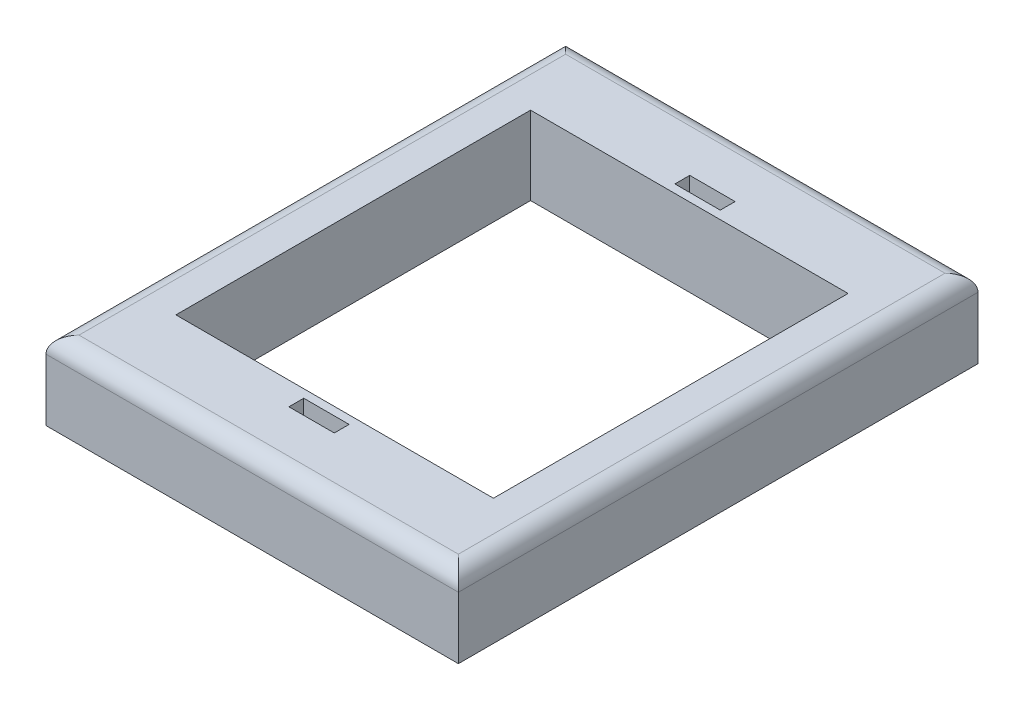
ISO-10303-21;
HEADER;
FILE_DESCRIPTION(('STEP AP214'),'2;1');
FILE_NAME('part.step','',(''),(''),'','','');
FILE_SCHEMA(('AUTOMOTIVE_DESIGN { 1 0 10303 214 1 1 1 1 }'));
ENDSEC;
DATA;
#1=APPLICATION_CONTEXT('core data for automotive mechanical design processes');
#2=APPLICATION_PROTOCOL_DEFINITION('international standard','automotive_design',2000,#1);
#3=PRODUCT_CONTEXT('',#1,'mechanical');
#4=PRODUCT('Part','Part','',(#3));
#5=PRODUCT_RELATED_PRODUCT_CATEGORY('part','',(#4));
#6=PRODUCT_DEFINITION_FORMATION('','',#4);
#7=PRODUCT_DEFINITION_CONTEXT('part definition',#1,'design');
#8=PRODUCT_DEFINITION('design','',#6,#7);
#9=PRODUCT_DEFINITION_SHAPE('','',#8);
#10=(LENGTH_UNIT() NAMED_UNIT(*) SI_UNIT(.MILLI.,.METRE.));
#11=(NAMED_UNIT(*) PLANE_ANGLE_UNIT() SI_UNIT($,.RADIAN.));
#12=(NAMED_UNIT(*) SI_UNIT($,.STERADIAN.) SOLID_ANGLE_UNIT());
#13=UNCERTAINTY_MEASURE_WITH_UNIT(LENGTH_MEASURE(1.E-05),#10,'distance_accuracy_value','');
#14=(GEOMETRIC_REPRESENTATION_CONTEXT(3) GLOBAL_UNCERTAINTY_ASSIGNED_CONTEXT((#13)) GLOBAL_UNIT_ASSIGNED_CONTEXT((#10,
#11,#12)) REPRESENTATION_CONTEXT('',''));
#15=CARTESIAN_POINT('',(0.,0.,0.));
#16=DIRECTION('',(0.,0.,1.));
#17=DIRECTION('',(1.,0.,0.));
#18=AXIS2_PLACEMENT_3D('',#15,#16,#17);
#19=CARTESIAN_POINT('',(0.,9.5,0.));
#20=DIRECTION('',(0.,-1.,0.));
#21=DIRECTION('',(0.,0.,-1.));
#22=AXIS2_PLACEMENT_3D('',#19,#20,#21);
#23=PLANE('',#22);
#24=DIRECTION('',(-1.,0.,0.));
#25=VECTOR('',#24,1.);
#26=CARTESIAN_POINT('',(0.,9.5,-37.6431451612903));
#27=LINE('',#26,#25);
#28=CARTESIAN_POINT('',(-0.459677419354818,9.5,-37.6431451612903));
#29=VERTEX_POINT('',#28);
#30=CARTESIAN_POINT('',(-46.4596774193548,9.5,-37.6431451612903));
#31=VERTEX_POINT('',#30);
#32=EDGE_CURVE('E288',#29,#31,#27,.T.);
#33=ORIENTED_EDGE('',*,*,#32,.T.);
#34=DIRECTION('',(0.,0.,1.));
#35=VECTOR('',#34,1.);
#36=CARTESIAN_POINT('',(-46.4596774193548,9.5,0.));
#37=LINE('',#36,#35);
#38=CARTESIAN_POINT('',(-46.4596774193548,9.5,21.3568548387097));
#39=VERTEX_POINT('',#38);
#40=EDGE_CURVE('E294',#31,#39,#37,.T.);
#41=ORIENTED_EDGE('',*,*,#40,.T.);
#42=DIRECTION('',(1.,0.,0.));
#43=VECTOR('',#42,1.);
#44=CARTESIAN_POINT('',(0.,9.5,21.3568548387097));
#45=LINE('',#44,#43);
#46=CARTESIAN_POINT('',(-0.459677419354811,9.5,21.3568548387097));
#47=VERTEX_POINT('',#46);
#48=EDGE_CURVE('E292',#39,#47,#45,.T.);
#49=ORIENTED_EDGE('',*,*,#48,.T.);
#50=DIRECTION('',(0.,0.,-1.));
#51=VECTOR('',#50,1.);
#52=CARTESIAN_POINT('',(-0.459677419354814,9.5,0.));
#53=LINE('',#52,#51);
#54=EDGE_CURVE('E290',#47,#29,#53,.T.);
#55=ORIENTED_EDGE('',*,*,#54,.T.);
#56=EDGE_LOOP('',(#33,#41,#49,#55));
#57=FACE_BOUND('',#56,.T.);
#58=DIRECTION('',(1.,0.,0.));
#59=VECTOR('',#58,1.);
#60=CARTESIAN_POINT('',(-26.2096774193548,9.5,-30.6431451612903));
#61=LINE('',#60,#59);
#62=CARTESIAN_POINT('',(-26.2096774193548,9.5,-30.6431451612903));
#63=VERTEX_POINT('',#62);
#64=CARTESIAN_POINT('',(-20.7096774193548,9.5,-30.6431451612903));
#65=VERTEX_POINT('',#64);
#66=EDGE_CURVE('E196',#63,#65,#61,.T.);
#67=ORIENTED_EDGE('',*,*,#66,.F.);
#68=DIRECTION('',(0.,0.,1.));
#69=VECTOR('',#68,1.);
#70=CARTESIAN_POINT('',(-26.2096774193548,9.5,-32.4431451612903));
#71=LINE('',#70,#69);
#72=CARTESIAN_POINT('',(-26.2096774193548,9.5,-32.4431451612903));
#73=VERTEX_POINT('',#72);
#74=EDGE_CURVE('E169',#73,#63,#71,.T.);
#75=ORIENTED_EDGE('',*,*,#74,.F.);
#76=DIRECTION('',(-1.,0.,0.));
#77=VECTOR('',#76,1.);
#78=CARTESIAN_POINT('',(-26.2096774193548,9.5,-32.4431451612903));
#79=LINE('',#78,#77);
#80=CARTESIAN_POINT('',(-20.7096774193548,9.5,-32.4431451612903));
#81=VERTEX_POINT('',#80);
#82=EDGE_CURVE('E187',#81,#73,#79,.T.);
#83=ORIENTED_EDGE('',*,*,#82,.F.);
#84=DIRECTION('',(0.,0.,-1.));
#85=VECTOR('',#84,1.);
#86=CARTESIAN_POINT('',(-20.7096774193548,9.5,-32.4431451612903));
#87=LINE('',#86,#85);
#88=EDGE_CURVE('E190',#65,#81,#87,.T.);
#89=ORIENTED_EDGE('',*,*,#88,.F.);
#90=EDGE_LOOP('',(#67,#75,#83,#89));
#91=FACE_BOUND('',#90,.T.);
#92=DIRECTION('',(1.,0.,0.));
#93=VECTOR('',#92,1.);
#94=CARTESIAN_POINT('',(-26.2096774193548,9.5,16.1568548387097));
#95=LINE('',#94,#93);
#96=CARTESIAN_POINT('',(-26.2096774193548,9.5,16.1568548387097));
#97=VERTEX_POINT('',#96);
#98=CARTESIAN_POINT('',(-20.7096774193548,9.5,16.1568548387097));
#99=VERTEX_POINT('',#98);
#100=EDGE_CURVE('E223',#97,#99,#95,.T.);
#101=ORIENTED_EDGE('',*,*,#100,.F.);
#102=DIRECTION('',(0.,0.,1.));
#103=VECTOR('',#102,1.);
#104=CARTESIAN_POINT('',(-26.2096774193548,9.5,14.3568548387097));
#105=LINE('',#104,#103);
#106=CARTESIAN_POINT('',(-26.2096774193548,9.5,14.3568548387097));
#107=VERTEX_POINT('',#106);
#108=EDGE_CURVE('E221',#107,#97,#105,.T.);
#109=ORIENTED_EDGE('',*,*,#108,.F.);
#110=DIRECTION('',(-1.,0.,0.));
#111=VECTOR('',#110,1.);
#112=CARTESIAN_POINT('',(-26.2096774193548,9.5,14.3568548387097));
#113=LINE('',#112,#111);
#114=CARTESIAN_POINT('',(-20.7096774193548,9.5,14.3568548387097));
#115=VERTEX_POINT('',#114);
#116=EDGE_CURVE('E211',#115,#107,#113,.T.);
#117=ORIENTED_EDGE('',*,*,#116,.F.);
#118=DIRECTION('',(0.,0.,-1.));
#119=VECTOR('',#118,1.);
#120=CARTESIAN_POINT('',(-20.7096774193548,9.5,14.3568548387097));
#121=LINE('',#120,#119);
#122=EDGE_CURVE('E226',#99,#115,#121,.T.);
#123=ORIENTED_EDGE('',*,*,#122,.F.);
#124=EDGE_LOOP('',(#101,#109,#117,#123));
#125=FACE_BOUND('',#124,.T.);
#126=DIRECTION('',(0.,0.,-1.));
#127=VECTOR('',#126,1.);
#128=CARTESIAN_POINT('',(-4.20967741935482,9.5,-29.6431451612903));
#129=LINE('',#128,#127);
#130=CARTESIAN_POINT('',(-4.20967741935481,9.5,13.3568548387097));
#131=VERTEX_POINT('',#130);
#132=CARTESIAN_POINT('',(-4.20967741935482,9.5,-29.6431451612903));
#133=VERTEX_POINT('',#132);
#134=EDGE_CURVE('E238',#131,#133,#129,.T.);
#135=ORIENTED_EDGE('',*,*,#134,.F.);
#136=DIRECTION('',(1.,0.,0.));
#137=VECTOR('',#136,1.);
#138=CARTESIAN_POINT('',(-42.7096774193548,9.5,13.3568548387097));
#139=LINE('',#138,#137);
#140=CARTESIAN_POINT('',(-42.7096774193548,9.5,13.3568548387097));
#141=VERTEX_POINT('',#140);
#142=EDGE_CURVE('E246',#141,#131,#139,.T.);
#143=ORIENTED_EDGE('',*,*,#142,.F.);
#144=DIRECTION('',(0.,0.,1.));
#145=VECTOR('',#144,1.);
#146=CARTESIAN_POINT('',(-42.7096774193548,9.5,-29.6431451612903));
#147=LINE('',#146,#145);
#148=CARTESIAN_POINT('',(-42.7096774193548,9.5,-29.6431451612903));
#149=VERTEX_POINT('',#148);
#150=EDGE_CURVE('E243',#149,#141,#147,.T.);
#151=ORIENTED_EDGE('',*,*,#150,.F.);
#152=DIRECTION('',(-1.,0.,0.));
#153=VECTOR('',#152,1.);
#154=CARTESIAN_POINT('',(-4.20967741935482,9.5,-29.6431451612903));
#155=LINE('',#154,#153);
#156=EDGE_CURVE('E240',#133,#149,#155,.T.);
#157=ORIENTED_EDGE('',*,*,#156,.F.);
#158=EDGE_LOOP('',(#135,#143,#151,#157));
#159=FACE_BOUND('',#158,.T.);
#160=ADVANCED_FACE('F37',(#57,#91,#125,#159),#23,.F.);
#161=CARTESIAN_POINT('',(0.,0.,0.));
#162=DIRECTION('',(0.,-1.,0.));
#163=DIRECTION('',(0.,0.,-1.));
#164=AXIS2_PLACEMENT_3D('',#161,#162,#163);
#165=PLANE('',#164);
#166=DIRECTION('',(0.,0.,1.));
#167=VECTOR('',#166,1.);
#168=CARTESIAN_POINT('',(-26.2096774193548,0.,-32.4431451612903));
#169=LINE('',#168,#167);
#170=CARTESIAN_POINT('',(-26.2096774193548,0.,-32.4431451612903));
#171=VERTEX_POINT('',#170);
#172=CARTESIAN_POINT('',(-26.2096774193548,0.,-30.6431451612903));
#173=VERTEX_POINT('',#172);
#174=EDGE_CURVE('E166',#171,#173,#169,.T.);
#175=ORIENTED_EDGE('',*,*,#174,.T.);
#176=DIRECTION('',(1.,0.,0.));
#177=VECTOR('',#176,1.);
#178=CARTESIAN_POINT('',(-26.2096774193548,0.,-30.6431451612903));
#179=LINE('',#178,#177);
#180=CARTESIAN_POINT('',(-20.7096774193548,0.,-30.6431451612903));
#181=VERTEX_POINT('',#180);
#182=EDGE_CURVE('E178',#173,#181,#179,.T.);
#183=ORIENTED_EDGE('',*,*,#182,.T.);
#184=DIRECTION('',(0.,0.,-1.));
#185=VECTOR('',#184,1.);
#186=CARTESIAN_POINT('',(-20.7096774193548,0.,-32.4431451612903));
#187=LINE('',#186,#185);
#188=CARTESIAN_POINT('',(-20.7096774193548,0.,-32.4431451612903));
#189=VERTEX_POINT('',#188);
#190=EDGE_CURVE('E182',#181,#189,#187,.T.);
#191=ORIENTED_EDGE('',*,*,#190,.T.);
#192=DIRECTION('',(-1.,0.,0.));
#193=VECTOR('',#192,1.);
#194=CARTESIAN_POINT('',(-26.2096774193548,0.,-32.4431451612903));
#195=LINE('',#194,#193);
#196=EDGE_CURVE('E174',#189,#171,#195,.T.);
#197=ORIENTED_EDGE('',*,*,#196,.T.);
#198=EDGE_LOOP('',(#175,#183,#191,#197));
#199=FACE_BOUND('',#198,.T.);
#200=DIRECTION('',(0.,0.,1.));
#201=VECTOR('',#200,1.);
#202=CARTESIAN_POINT('',(-26.2096774193548,0.,14.3568548387097));
#203=LINE('',#202,#201);
#204=CARTESIAN_POINT('',(-26.2096774193548,0.,14.3568548387097));
#205=VERTEX_POINT('',#204);
#206=CARTESIAN_POINT('',(-26.2096774193548,0.,16.1568548387097));
#207=VERTEX_POINT('',#206);
#208=EDGE_CURVE('E207',#205,#207,#203,.T.);
#209=ORIENTED_EDGE('',*,*,#208,.T.);
#210=DIRECTION('',(1.,0.,0.));
#211=VECTOR('',#210,1.);
#212=CARTESIAN_POINT('',(-26.2096774193548,0.,16.1568548387097));
#213=LINE('',#212,#211);
#214=CARTESIAN_POINT('',(-20.7096774193548,0.,16.1568548387097));
#215=VERTEX_POINT('',#214);
#216=EDGE_CURVE('E210',#207,#215,#213,.T.);
#217=ORIENTED_EDGE('',*,*,#216,.T.);
#218=DIRECTION('',(0.,0.,-1.));
#219=VECTOR('',#218,1.);
#220=CARTESIAN_POINT('',(-20.7096774193548,0.,14.3568548387097));
#221=LINE('',#220,#219);
#222=CARTESIAN_POINT('',(-20.7096774193548,0.,14.3568548387097));
#223=VERTEX_POINT('',#222);
#224=EDGE_CURVE('E214',#215,#223,#221,.T.);
#225=ORIENTED_EDGE('',*,*,#224,.T.);
#226=DIRECTION('',(-1.,0.,0.));
#227=VECTOR('',#226,1.);
#228=CARTESIAN_POINT('',(-26.2096774193548,0.,14.3568548387097));
#229=LINE('',#228,#227);
#230=EDGE_CURVE('E217',#223,#205,#229,.T.);
#231=ORIENTED_EDGE('',*,*,#230,.T.);
#232=EDGE_LOOP('',(#209,#217,#225,#231));
#233=FACE_BOUND('',#232,.T.);
#234=DIRECTION('',(0.,0.,-1.));
#235=VECTOR('',#234,1.);
#236=CARTESIAN_POINT('',(1.54032258064518,0.,-39.6431451612903));
#237=LINE('',#236,#235);
#238=CARTESIAN_POINT('',(1.54032258064519,0.,23.3568548387097));
#239=VERTEX_POINT('',#238);
#240=CARTESIAN_POINT('',(1.54032258064518,0.,-39.6431451612903));
#241=VERTEX_POINT('',#240);
#242=EDGE_CURVE('E268',#239,#241,#237,.T.);
#243=ORIENTED_EDGE('',*,*,#242,.F.);
#244=DIRECTION('',(1.,0.,0.));
#245=VECTOR('',#244,1.);
#246=CARTESIAN_POINT('',(1.54032258064519,0.,23.3568548387097));
#247=LINE('',#246,#245);
#248=CARTESIAN_POINT('',(-48.4596774193548,0.,23.3568548387097));
#249=VERTEX_POINT('',#248);
#250=EDGE_CURVE('E277',#249,#239,#247,.T.);
#251=ORIENTED_EDGE('',*,*,#250,.F.);
#252=DIRECTION('',(0.,0.,1.));
#253=VECTOR('',#252,1.);
#254=CARTESIAN_POINT('',(-48.4596774193548,0.,23.3568548387097));
#255=LINE('',#254,#253);
#256=CARTESIAN_POINT('',(-48.4596774193548,0.,-39.6431451612903));
#257=VERTEX_POINT('',#256);
#258=EDGE_CURVE('E274',#257,#249,#255,.T.);
#259=ORIENTED_EDGE('',*,*,#258,.F.);
#260=DIRECTION('',(-1.,0.,0.));
#261=VECTOR('',#260,1.);
#262=CARTESIAN_POINT('',(-48.4596774193548,0.,-39.6431451612903));
#263=LINE('',#262,#261);
#264=EDGE_CURVE('E271',#241,#257,#263,.T.);
#265=ORIENTED_EDGE('',*,*,#264,.F.);
#266=EDGE_LOOP('',(#243,#251,#259,#265));
#267=FACE_BOUND('',#266,.T.);
#268=DIRECTION('',(1.,0.,0.));
#269=VECTOR('',#268,1.);
#270=CARTESIAN_POINT('',(-42.7096774193548,0.,13.3568548387097));
#271=LINE('',#270,#269);
#272=CARTESIAN_POINT('',(-42.7096774193548,0.,13.3568548387097));
#273=VERTEX_POINT('',#272);
#274=CARTESIAN_POINT('',(-4.20967741935481,0.,13.3568548387097));
#275=VERTEX_POINT('',#274);
#276=EDGE_CURVE('E241',#273,#275,#271,.T.);
#277=ORIENTED_EDGE('',*,*,#276,.T.);
#278=DIRECTION('',(0.,0.,-1.));
#279=VECTOR('',#278,1.);
#280=CARTESIAN_POINT('',(-4.20967741935482,0.,-29.6431451612903));
#281=LINE('',#280,#279);
#282=CARTESIAN_POINT('',(-4.20967741935482,0.,-29.6431451612903));
#283=VERTEX_POINT('',#282);
#284=EDGE_CURVE('E203',#275,#283,#281,.T.);
#285=ORIENTED_EDGE('',*,*,#284,.T.);
#286=DIRECTION('',(-1.,0.,0.));
#287=VECTOR('',#286,1.);
#288=CARTESIAN_POINT('',(-4.20967741935482,0.,-29.6431451612903));
#289=LINE('',#288,#287);
#290=CARTESIAN_POINT('',(-42.7096774193548,0.,-29.6431451612903));
#291=VERTEX_POINT('',#290);
#292=EDGE_CURVE('E251',#283,#291,#289,.T.);
#293=ORIENTED_EDGE('',*,*,#292,.T.);
#294=DIRECTION('',(0.,0.,1.));
#295=VECTOR('',#294,1.);
#296=CARTESIAN_POINT('',(-42.7096774193548,0.,-29.6431451612903));
#297=LINE('',#296,#295);
#298=EDGE_CURVE('E254',#291,#273,#297,.T.);
#299=ORIENTED_EDGE('',*,*,#298,.T.);
#300=EDGE_LOOP('',(#277,#285,#293,#299));
#301=FACE_BOUND('',#300,.T.);
#302=ADVANCED_FACE('F184',(#199,#233,#267,#301),#165,.T.);
#303=CARTESIAN_POINT('',(1.54032258064518,9.5,-39.6431451612903));
#304=DIRECTION('',(-1.,0.,0.));
#305=DIRECTION('',(0.,0.,1.));
#306=AXIS2_PLACEMENT_3D('',#303,#304,#305);
#307=PLANE('',#306);
#308=DIRECTION('',(0.,-1.,0.));
#309=VECTOR('',#308,1.);
#310=CARTESIAN_POINT('',(1.54032258064518,9.5,-39.6431451612903));
#311=LINE('',#310,#309);
#312=CARTESIAN_POINT('',(1.54032258064518,7.5,-39.6431451612903));
#313=VERTEX_POINT('',#312);
#314=EDGE_CURVE('E286',#313,#241,#311,.T.);
#315=ORIENTED_EDGE('',*,*,#314,.F.);
#316=DIRECTION('',(0.,0.,-1.));
#317=VECTOR('',#316,1.);
#318=CARTESIAN_POINT('',(1.54032258064518,7.5,-39.6431451612903));
#319=LINE('',#318,#317);
#320=CARTESIAN_POINT('',(1.54032258064519,7.5,23.3568548387097));
#321=VERTEX_POINT('',#320);
#322=EDGE_CURVE('E46',#313,#321,#319,.F.);
#323=ORIENTED_EDGE('',*,*,#322,.T.);
#324=DIRECTION('',(0.,-1.,0.));
#325=VECTOR('',#324,1.);
#326=CARTESIAN_POINT('',(1.54032258064519,9.5,23.3568548387097));
#327=LINE('',#326,#325);
#328=EDGE_CURVE('E280',#321,#239,#327,.T.);
#329=ORIENTED_EDGE('',*,*,#328,.T.);
#330=ORIENTED_EDGE('',*,*,#242,.T.);
#331=EDGE_LOOP('',(#315,#323,#329,#330));
#332=FACE_BOUND('',#331,.T.);
#333=ADVANCED_FACE('F376',(#332),#307,.F.);
#334=CARTESIAN_POINT('',(-48.4596774193548,9.5,-39.6431451612903));
#335=DIRECTION('',(0.,0.,1.));
#336=DIRECTION('',(1.,0.,0.));
#337=AXIS2_PLACEMENT_3D('',#334,#335,#336);
#338=PLANE('',#337);
#339=DIRECTION('',(0.,-1.,0.));
#340=VECTOR('',#339,1.);
#341=CARTESIAN_POINT('',(-48.4596774193548,9.5,-39.6431451612903));
#342=LINE('',#341,#340);
#343=CARTESIAN_POINT('',(-48.4596774193548,7.5,-39.6431451612903));
#344=VERTEX_POINT('',#343);
#345=EDGE_CURVE('E284',#344,#257,#342,.T.);
#346=ORIENTED_EDGE('',*,*,#345,.F.);
#347=DIRECTION('',(-1.,0.,0.));
#348=VECTOR('',#347,1.);
#349=CARTESIAN_POINT('',(-48.4596774193548,7.5,-39.6431451612903));
#350=LINE('',#349,#348);
#351=EDGE_CURVE('E11',#344,#313,#350,.F.);
#352=ORIENTED_EDGE('',*,*,#351,.T.);
#353=ORIENTED_EDGE('',*,*,#314,.T.);
#354=ORIENTED_EDGE('',*,*,#264,.T.);
#355=EDGE_LOOP('',(#346,#352,#353,#354));
#356=FACE_BOUND('',#355,.T.);
#357=ADVANCED_FACE('F381',(#356),#338,.F.);
#358=CARTESIAN_POINT('',(-48.4596774193548,9.5,23.3568548387097));
#359=DIRECTION('',(1.,0.,0.));
#360=DIRECTION('',(0.,0.,-1.));
#361=AXIS2_PLACEMENT_3D('',#358,#359,#360);
#362=PLANE('',#361);
#363=DIRECTION('',(0.,-1.,0.));
#364=VECTOR('',#363,1.);
#365=CARTESIAN_POINT('',(-48.4596774193548,9.5,23.3568548387097));
#366=LINE('',#365,#364);
#367=CARTESIAN_POINT('',(-48.4596774193548,7.5,23.3568548387097));
#368=VERTEX_POINT('',#367);
#369=EDGE_CURVE('E282',#368,#249,#366,.T.);
#370=ORIENTED_EDGE('',*,*,#369,.F.);
#371=DIRECTION('',(0.,0.,1.));
#372=VECTOR('',#371,1.);
#373=CARTESIAN_POINT('',(-48.4596774193548,7.5,23.3568548387097));
#374=LINE('',#373,#372);
#375=EDGE_CURVE('E297',#368,#344,#374,.F.);
#376=ORIENTED_EDGE('',*,*,#375,.T.);
#377=ORIENTED_EDGE('',*,*,#345,.T.);
#378=ORIENTED_EDGE('',*,*,#258,.T.);
#379=EDGE_LOOP('',(#370,#376,#377,#378));
#380=FACE_BOUND('',#379,.T.);
#381=ADVANCED_FACE('F327',(#380),#362,.F.);
#382=CARTESIAN_POINT('',(1.54032258064519,9.5,23.3568548387097));
#383=DIRECTION('',(0.,0.,-1.));
#384=DIRECTION('',(-1.,0.,0.));
#385=AXIS2_PLACEMENT_3D('',#382,#383,#384);
#386=PLANE('',#385);
#387=ORIENTED_EDGE('',*,*,#328,.F.);
#388=DIRECTION('',(1.,0.,0.));
#389=VECTOR('',#388,1.);
#390=CARTESIAN_POINT('',(1.54032258064519,7.5,23.3568548387097));
#391=LINE('',#390,#389);
#392=EDGE_CURVE('E300',#321,#368,#391,.F.);
#393=ORIENTED_EDGE('',*,*,#392,.T.);
#394=ORIENTED_EDGE('',*,*,#369,.T.);
#395=ORIENTED_EDGE('',*,*,#250,.T.);
#396=EDGE_LOOP('',(#387,#393,#394,#395));
#397=FACE_BOUND('',#396,.T.);
#398=ADVANCED_FACE('F324',(#397),#386,.F.);
#399=CARTESIAN_POINT('',(-4.20967741935482,9.5,-29.6431451612903));
#400=DIRECTION('',(-1.,0.,0.));
#401=DIRECTION('',(0.,0.,1.));
#402=AXIS2_PLACEMENT_3D('',#399,#400,#401);
#403=PLANE('',#402);
#404=ORIENTED_EDGE('',*,*,#284,.F.);
#405=DIRECTION('',(0.,-1.,0.));
#406=VECTOR('',#405,1.);
#407=CARTESIAN_POINT('',(-4.20967741935481,9.5,13.3568548387097));
#408=LINE('',#407,#406);
#409=EDGE_CURVE('E248',#131,#275,#408,.T.);
#410=ORIENTED_EDGE('',*,*,#409,.F.);
#411=ORIENTED_EDGE('',*,*,#134,.T.);
#412=DIRECTION('',(0.,-1.,0.));
#413=VECTOR('',#412,1.);
#414=CARTESIAN_POINT('',(-4.20967741935482,9.5,-29.6431451612903));
#415=LINE('',#414,#413);
#416=EDGE_CURVE('E265',#133,#283,#415,.T.);
#417=ORIENTED_EDGE('',*,*,#416,.T.);
#418=EDGE_LOOP('',(#404,#410,#411,#417));
#419=FACE_BOUND('',#418,.T.);
#420=ADVANCED_FACE('F350',(#419),#403,.T.);
#421=CARTESIAN_POINT('',(-4.20967741935482,9.5,-29.6431451612903));
#422=DIRECTION('',(0.,0.,1.));
#423=DIRECTION('',(1.,0.,0.));
#424=AXIS2_PLACEMENT_3D('',#421,#422,#423);
#425=PLANE('',#424);
#426=ORIENTED_EDGE('',*,*,#292,.F.);
#427=ORIENTED_EDGE('',*,*,#416,.F.);
#428=ORIENTED_EDGE('',*,*,#156,.T.);
#429=DIRECTION('',(0.,-1.,0.));
#430=VECTOR('',#429,1.);
#431=CARTESIAN_POINT('',(-42.7096774193548,9.5,-29.6431451612903));
#432=LINE('',#431,#430);
#433=EDGE_CURVE('E263',#149,#291,#432,.T.);
#434=ORIENTED_EDGE('',*,*,#433,.T.);
#435=EDGE_LOOP('',(#426,#427,#428,#434));
#436=FACE_BOUND('',#435,.T.);
#437=ADVANCED_FACE('F352',(#436),#425,.T.);
#438=CARTESIAN_POINT('',(-42.7096774193548,9.5,-29.6431451612903));
#439=DIRECTION('',(1.,0.,0.));
#440=DIRECTION('',(0.,0.,-1.));
#441=AXIS2_PLACEMENT_3D('',#438,#439,#440);
#442=PLANE('',#441);
#443=ORIENTED_EDGE('',*,*,#298,.F.);
#444=ORIENTED_EDGE('',*,*,#433,.F.);
#445=ORIENTED_EDGE('',*,*,#150,.T.);
#446=DIRECTION('',(0.,-1.,0.));
#447=VECTOR('',#446,1.);
#448=CARTESIAN_POINT('',(-42.7096774193548,9.5,13.3568548387097));
#449=LINE('',#448,#447);
#450=EDGE_CURVE('E261',#141,#273,#449,.T.);
#451=ORIENTED_EDGE('',*,*,#450,.T.);
#452=EDGE_LOOP('',(#443,#444,#445,#451));
#453=FACE_BOUND('',#452,.T.);
#454=ADVANCED_FACE('F360',(#453),#442,.T.);
#455=CARTESIAN_POINT('',(-42.7096774193548,9.5,13.3568548387097));
#456=DIRECTION('',(0.,0.,-1.));
#457=DIRECTION('',(-1.,0.,0.));
#458=AXIS2_PLACEMENT_3D('',#455,#456,#457);
#459=PLANE('',#458);
#460=ORIENTED_EDGE('',*,*,#276,.F.);
#461=ORIENTED_EDGE('',*,*,#450,.F.);
#462=ORIENTED_EDGE('',*,*,#142,.T.);
#463=ORIENTED_EDGE('',*,*,#409,.T.);
#464=EDGE_LOOP('',(#460,#461,#462,#463));
#465=FACE_BOUND('',#464,.T.);
#466=ADVANCED_FACE('F358',(#465),#459,.T.);
#467=CARTESIAN_POINT('',(-26.2096774193548,0.,14.3568548387097));
#468=DIRECTION('',(-1.,0.,0.));
#469=DIRECTION('',(0.,0.,1.));
#470=AXIS2_PLACEMENT_3D('',#467,#468,#469);
#471=PLANE('',#470);
#472=ORIENTED_EDGE('',*,*,#108,.T.);
#473=DIRECTION('',(0.,1.,0.));
#474=VECTOR('',#473,1.);
#475=CARTESIAN_POINT('',(-26.2096774193548,0.,16.1568548387097));
#476=LINE('',#475,#474);
#477=EDGE_CURVE('E220',#207,#97,#476,.T.);
#478=ORIENTED_EDGE('',*,*,#477,.F.);
#479=ORIENTED_EDGE('',*,*,#208,.F.);
#480=DIRECTION('',(0.,1.,0.));
#481=VECTOR('',#480,1.);
#482=CARTESIAN_POINT('',(-26.2096774193548,0.,14.3568548387097));
#483=LINE('',#482,#481);
#484=EDGE_CURVE('E197',#205,#107,#483,.T.);
#485=ORIENTED_EDGE('',*,*,#484,.T.);
#486=EDGE_LOOP('',(#472,#478,#479,#485));
#487=FACE_BOUND('',#486,.T.);
#488=ADVANCED_FACE('F367',(#487),#471,.F.);
#489=CARTESIAN_POINT('',(-26.2096774193548,0.,14.3568548387097));
#490=DIRECTION('',(0.,0.,-1.));
#491=DIRECTION('',(-1.,0.,0.));
#492=AXIS2_PLACEMENT_3D('',#489,#490,#491);
#493=PLANE('',#492);
#494=ORIENTED_EDGE('',*,*,#116,.T.);
#495=ORIENTED_EDGE('',*,*,#484,.F.);
#496=ORIENTED_EDGE('',*,*,#230,.F.);
#497=DIRECTION('',(0.,1.,0.));
#498=VECTOR('',#497,1.);
#499=CARTESIAN_POINT('',(-20.7096774193548,0.,14.3568548387097));
#500=LINE('',#499,#498);
#501=EDGE_CURVE('E232',#223,#115,#500,.T.);
#502=ORIENTED_EDGE('',*,*,#501,.T.);
#503=EDGE_LOOP('',(#494,#495,#496,#502));
#504=FACE_BOUND('',#503,.T.);
#505=ADVANCED_FACE('F409',(#504),#493,.F.);
#506=CARTESIAN_POINT('',(-20.7096774193548,0.,14.3568548387097));
#507=DIRECTION('',(1.,0.,0.));
#508=DIRECTION('',(0.,0.,-1.));
#509=AXIS2_PLACEMENT_3D('',#506,#507,#508);
#510=PLANE('',#509);
#511=ORIENTED_EDGE('',*,*,#122,.T.);
#512=ORIENTED_EDGE('',*,*,#501,.F.);
#513=ORIENTED_EDGE('',*,*,#224,.F.);
#514=DIRECTION('',(0.,1.,0.));
#515=VECTOR('',#514,1.);
#516=CARTESIAN_POINT('',(-20.7096774193548,0.,16.1568548387097));
#517=LINE('',#516,#515);
#518=EDGE_CURVE('E234',#215,#99,#517,.T.);
#519=ORIENTED_EDGE('',*,*,#518,.T.);
#520=EDGE_LOOP('',(#511,#512,#513,#519));
#521=FACE_BOUND('',#520,.T.);
#522=ADVANCED_FACE('F412',(#521),#510,.F.);
#523=CARTESIAN_POINT('',(-26.2096774193548,0.,16.1568548387097));
#524=DIRECTION('',(0.,0.,1.));
#525=DIRECTION('',(1.,0.,0.));
#526=AXIS2_PLACEMENT_3D('',#523,#524,#525);
#527=PLANE('',#526);
#528=ORIENTED_EDGE('',*,*,#100,.T.);
#529=ORIENTED_EDGE('',*,*,#518,.F.);
#530=ORIENTED_EDGE('',*,*,#216,.F.);
#531=ORIENTED_EDGE('',*,*,#477,.T.);
#532=EDGE_LOOP('',(#528,#529,#530,#531));
#533=FACE_BOUND('',#532,.T.);
#534=ADVANCED_FACE('F408',(#533),#527,.F.);
#535=CARTESIAN_POINT('',(-26.2096774193548,0.,-32.4431451612903));
#536=DIRECTION('',(-1.,0.,0.));
#537=DIRECTION('',(0.,0.,1.));
#538=AXIS2_PLACEMENT_3D('',#535,#536,#537);
#539=PLANE('',#538);
#540=ORIENTED_EDGE('',*,*,#74,.T.);
#541=DIRECTION('',(0.,1.,0.));
#542=VECTOR('',#541,1.);
#543=CARTESIAN_POINT('',(-26.2096774193548,0.,-30.6431451612903));
#544=LINE('',#543,#542);
#545=EDGE_CURVE('E162',#173,#63,#544,.T.);
#546=ORIENTED_EDGE('',*,*,#545,.F.);
#547=ORIENTED_EDGE('',*,*,#174,.F.);
#548=DIRECTION('',(0.,1.,0.));
#549=VECTOR('',#548,1.);
#550=CARTESIAN_POINT('',(-26.2096774193548,0.,-32.4431451612903));
#551=LINE('',#550,#549);
#552=EDGE_CURVE('E201',#171,#73,#551,.T.);
#553=ORIENTED_EDGE('',*,*,#552,.T.);
#554=EDGE_LOOP('',(#540,#546,#547,#553));
#555=FACE_BOUND('',#554,.T.);
#556=ADVANCED_FACE('F164',(#555),#539,.F.);
#557=CARTESIAN_POINT('',(-26.2096774193548,0.,-32.4431451612903));
#558=DIRECTION('',(0.,0.,-1.));
#559=DIRECTION('',(-1.,0.,0.));
#560=AXIS2_PLACEMENT_3D('',#557,#558,#559);
#561=PLANE('',#560);
#562=ORIENTED_EDGE('',*,*,#82,.T.);
#563=ORIENTED_EDGE('',*,*,#552,.F.);
#564=ORIENTED_EDGE('',*,*,#196,.F.);
#565=DIRECTION('',(0.,1.,0.));
#566=VECTOR('',#565,1.);
#567=CARTESIAN_POINT('',(-20.7096774193548,0.,-32.4431451612903));
#568=LINE('',#567,#566);
#569=EDGE_CURVE('E204',#189,#81,#568,.T.);
#570=ORIENTED_EDGE('',*,*,#569,.T.);
#571=EDGE_LOOP('',(#562,#563,#564,#570));
#572=FACE_BOUND('',#571,.T.);
#573=ADVANCED_FACE('F401',(#572),#561,.F.);
#574=CARTESIAN_POINT('',(-20.7096774193548,0.,-32.4431451612903));
#575=DIRECTION('',(1.,0.,0.));
#576=DIRECTION('',(0.,0.,-1.));
#577=AXIS2_PLACEMENT_3D('',#574,#575,#576);
#578=PLANE('',#577);
#579=ORIENTED_EDGE('',*,*,#88,.T.);
#580=ORIENTED_EDGE('',*,*,#569,.F.);
#581=ORIENTED_EDGE('',*,*,#190,.F.);
#582=DIRECTION('',(0.,1.,0.));
#583=VECTOR('',#582,1.);
#584=CARTESIAN_POINT('',(-20.7096774193548,0.,-30.6431451612903));
#585=LINE('',#584,#583);
#586=EDGE_CURVE('E173',#181,#65,#585,.T.);
#587=ORIENTED_EDGE('',*,*,#586,.T.);
#588=EDGE_LOOP('',(#579,#580,#581,#587));
#589=FACE_BOUND('',#588,.T.);
#590=ADVANCED_FACE('F396',(#589),#578,.F.);
#591=CARTESIAN_POINT('',(-26.2096774193548,0.,-30.6431451612903));
#592=DIRECTION('',(0.,0.,1.));
#593=DIRECTION('',(1.,0.,0.));
#594=AXIS2_PLACEMENT_3D('',#591,#592,#593);
#595=PLANE('',#594);
#596=ORIENTED_EDGE('',*,*,#66,.T.);
#597=ORIENTED_EDGE('',*,*,#586,.F.);
#598=ORIENTED_EDGE('',*,*,#182,.F.);
#599=ORIENTED_EDGE('',*,*,#545,.T.);
#600=EDGE_LOOP('',(#596,#597,#598,#599));
#601=FACE_BOUND('',#600,.T.);
#602=ADVANCED_FACE('F179',(#601),#595,.F.);
#603=CARTESIAN_POINT('',(-0.459677419354814,7.5,0.));
#604=DIRECTION('',(0.,0.,-1.));
#605=DIRECTION('',(-1.,0.,0.));
#606=AXIS2_PLACEMENT_3D('',#603,#604,#605);
#607=CYLINDRICAL_SURFACE('',#606,2.);
#608=CARTESIAN_POINT('',(-0.459677419354811,7.5,21.3568548387097));
#609=DIRECTION('',(0.707106781186547,0.,-0.707106781186548));
#610=DIRECTION('',(-0.707106781186548,0.,-0.707106781186547));
#611=AXIS2_PLACEMENT_3D('',#608,#609,#610);
#612=ELLIPSE('',#611,2.82842712474619,2.);
#613=EDGE_CURVE('E306',#321,#47,#612,.F.);
#614=ORIENTED_EDGE('',*,*,#613,.F.);
#615=ORIENTED_EDGE('',*,*,#322,.F.);
#616=CARTESIAN_POINT('',(-0.459677419354818,7.5,-37.6431451612903));
#617=DIRECTION('',(-0.707106781186548,0.,-0.707106781186547));
#618=DIRECTION('',(-0.707106781186547,0.,0.707106781186548));
#619=AXIS2_PLACEMENT_3D('',#616,#617,#618);
#620=ELLIPSE('',#619,2.82842712474619,2.);
#621=EDGE_CURVE('E41',#29,#313,#620,.T.);
#622=ORIENTED_EDGE('',*,*,#621,.F.);
#623=ORIENTED_EDGE('',*,*,#54,.F.);
#624=EDGE_LOOP('',(#614,#615,#622,#623));
#625=FACE_BOUND('',#624,.T.);
#626=ADVANCED_FACE('F39',(#625),#607,.T.);
#627=CARTESIAN_POINT('',(0.,7.5,-37.6431451612903));
#628=DIRECTION('',(-1.,0.,0.));
#629=DIRECTION('',(0.,0.,1.));
#630=AXIS2_PLACEMENT_3D('',#627,#628,#629);
#631=CYLINDRICAL_SURFACE('',#630,2.);
#632=ORIENTED_EDGE('',*,*,#621,.T.);
#633=ORIENTED_EDGE('',*,*,#351,.F.);
#634=CARTESIAN_POINT('',(-46.4596774193548,7.5,-37.6431451612903));
#635=DIRECTION('',(-0.707106781186547,0.,0.707106781186547));
#636=DIRECTION('',(-0.707106781186547,0.,-0.707106781186547));
#637=AXIS2_PLACEMENT_3D('',#634,#635,#636);
#638=ELLIPSE('',#637,2.82842712474619,2.);
#639=EDGE_CURVE('E305',#31,#344,#638,.T.);
#640=ORIENTED_EDGE('',*,*,#639,.F.);
#641=ORIENTED_EDGE('',*,*,#32,.F.);
#642=EDGE_LOOP('',(#632,#633,#640,#641));
#643=FACE_BOUND('',#642,.T.);
#644=ADVANCED_FACE('F316',(#643),#631,.T.);
#645=CARTESIAN_POINT('',(0.,7.5,21.3568548387097));
#646=DIRECTION('',(1.,0.,0.));
#647=DIRECTION('',(0.,0.,-1.));
#648=AXIS2_PLACEMENT_3D('',#645,#646,#647);
#649=CYLINDRICAL_SURFACE('',#648,2.);
#650=ORIENTED_EDGE('',*,*,#613,.T.);
#651=ORIENTED_EDGE('',*,*,#48,.F.);
#652=CARTESIAN_POINT('',(-46.4596774193548,7.5,21.3568548387097));
#653=DIRECTION('',(0.707106781186548,0.,0.707106781186547));
#654=DIRECTION('',(0.707106781186547,0.,-0.707106781186548));
#655=AXIS2_PLACEMENT_3D('',#652,#653,#654);
#656=ELLIPSE('',#655,2.82842712474619,2.);
#657=EDGE_CURVE('E303',#368,#39,#656,.F.);
#658=ORIENTED_EDGE('',*,*,#657,.F.);
#659=ORIENTED_EDGE('',*,*,#392,.F.);
#660=EDGE_LOOP('',(#650,#651,#658,#659));
#661=FACE_BOUND('',#660,.T.);
#662=ADVANCED_FACE('F321',(#661),#649,.T.);
#663=CARTESIAN_POINT('',(-46.4596774193548,7.5,0.));
#664=DIRECTION('',(0.,0.,1.));
#665=DIRECTION('',(1.,0.,0.));
#666=AXIS2_PLACEMENT_3D('',#663,#664,#665);
#667=CYLINDRICAL_SURFACE('',#666,2.);
#668=ORIENTED_EDGE('',*,*,#639,.T.);
#669=ORIENTED_EDGE('',*,*,#375,.F.);
#670=ORIENTED_EDGE('',*,*,#657,.T.);
#671=ORIENTED_EDGE('',*,*,#40,.F.);
#672=EDGE_LOOP('',(#668,#669,#670,#671));
#673=FACE_BOUND('',#672,.T.);
#674=ADVANCED_FACE('F331',(#673),#667,.T.);
#675=CLOSED_SHELL('',(#160,#302,#333,#357,#381,#398,#420,#437,#454,#466,#488,#505,#522,#534,
#556,#573,#590,#602,#626,#644,#662,#674));
#676=MANIFOLD_SOLID_BREP('B2',#675);
#677=ADVANCED_BREP_SHAPE_REPRESENTATION('',(#18,#676),#14);
#678=SHAPE_DEFINITION_REPRESENTATION(#9,#677);
ENDSEC;
END-ISO-10303-21;
